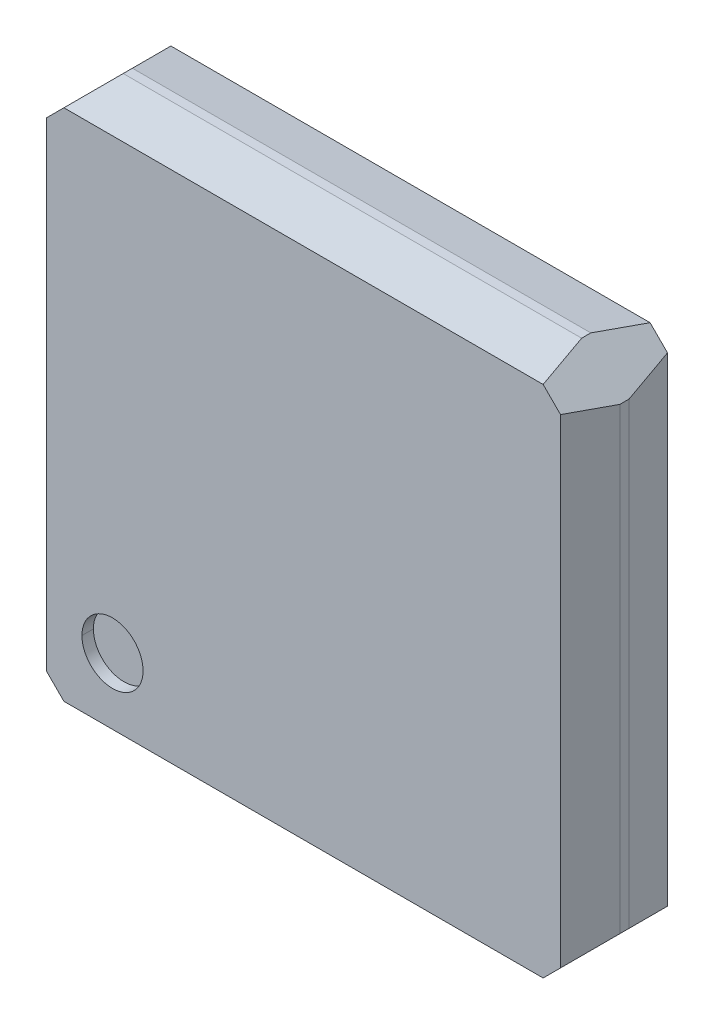
ISO-10303-21;
HEADER;
FILE_DESCRIPTION(('STEP AP214'),'2;1');
FILE_NAME('part.step','',(''),(''),'','','');
FILE_SCHEMA(('AUTOMOTIVE_DESIGN { 1 0 10303 214 1 1 1 1 }'));
ENDSEC;
DATA;
#1=APPLICATION_CONTEXT('core data for automotive mechanical design processes');
#2=APPLICATION_PROTOCOL_DEFINITION('international standard','automotive_design',2000,#1);
#3=PRODUCT_CONTEXT('',#1,'mechanical');
#4=PRODUCT('Part','Part','',(#3));
#5=PRODUCT_RELATED_PRODUCT_CATEGORY('part','',(#4));
#6=PRODUCT_DEFINITION_FORMATION('','',#4);
#7=PRODUCT_DEFINITION_CONTEXT('part definition',#1,'design');
#8=PRODUCT_DEFINITION('design','',#6,#7);
#9=PRODUCT_DEFINITION_SHAPE('','',#8);
#10=(LENGTH_UNIT() NAMED_UNIT(*) SI_UNIT(.MILLI.,.METRE.));
#11=(NAMED_UNIT(*) PLANE_ANGLE_UNIT() SI_UNIT($,.RADIAN.));
#12=(NAMED_UNIT(*) SI_UNIT($,.STERADIAN.) SOLID_ANGLE_UNIT());
#13=UNCERTAINTY_MEASURE_WITH_UNIT(LENGTH_MEASURE(1.E-05),#10,'distance_accuracy_value','');
#14=(GEOMETRIC_REPRESENTATION_CONTEXT(3) GLOBAL_UNCERTAINTY_ASSIGNED_CONTEXT((#13)) GLOBAL_UNIT_ASSIGNED_CONTEXT((#10,
#11,#12)) REPRESENTATION_CONTEXT('',''));
#15=CARTESIAN_POINT('',(0.,0.,0.));
#16=DIRECTION('',(0.,0.,1.));
#17=DIRECTION('',(1.,0.,0.));
#18=AXIS2_PLACEMENT_3D('',#15,#16,#17);
#19=CARTESIAN_POINT('',(-2.5,-2.5,1.25));
#20=DIRECTION('',(0.,0.,1.));
#21=DIRECTION('',(1.,0.,0.));
#22=AXIS2_PLACEMENT_3D('',#19,#20,#21);
#23=PLANE('',#22);
#24=CARTESIAN_POINT('',(-2.5,-2.5,1.25));
#25=DIRECTION('',(0.,0.,1.));
#26=DIRECTION('',(1.,0.,0.));
#27=AXIS2_PLACEMENT_3D('',#24,#25,#26);
#28=CIRCLE('',#27,0.4);
#29=CARTESIAN_POINT('',(-2.1,-2.5,1.25));
#30=VERTEX_POINT('',#29);
#31=CARTESIAN_POINT('',(-2.9,-2.5,1.25));
#32=VERTEX_POINT('',#31);
#33=EDGE_CURVE('E11',#30,#32,#28,.T.);
#34=ORIENTED_EDGE('',*,*,#33,.T.);
#35=CARTESIAN_POINT('',(-2.5,-2.5,1.25));
#36=DIRECTION('',(0.,0.,1.));
#37=DIRECTION('',(1.,0.,0.));
#38=AXIS2_PLACEMENT_3D('',#35,#36,#37);
#39=CIRCLE('',#38,0.4);
#40=EDGE_CURVE('E399',#32,#30,#39,.T.);
#41=ORIENTED_EDGE('',*,*,#40,.T.);
#42=EDGE_LOOP('',(#34,#41));
#43=FACE_BOUND('',#42,.T.);
#44=ADVANCED_FACE('F17',(#43),#23,.T.);
#45=CARTESIAN_POINT('',(-2.5,-2.5,1.25));
#46=DIRECTION('',(0.,0.,1.));
#47=DIRECTION('',(1.,0.,0.));
#48=AXIS2_PLACEMENT_3D('',#45,#46,#47);
#49=CYLINDRICAL_SURFACE('',#48,0.4);
#50=DIRECTION('',(0.,0.,1.));
#51=VECTOR('',#50,1.);
#52=CARTESIAN_POINT('',(-2.9,-2.5,1.25));
#53=LINE('',#52,#51);
#54=CARTESIAN_POINT('',(-2.9,-2.5,1.4));
#55=VERTEX_POINT('',#54);
#56=EDGE_CURVE('E225',#32,#55,#53,.T.);
#57=ORIENTED_EDGE('',*,*,#56,.F.);
#58=ORIENTED_EDGE('',*,*,#33,.F.);
#59=DIRECTION('',(0.,0.,1.));
#60=VECTOR('',#59,1.);
#61=CARTESIAN_POINT('',(-2.1,-2.5,1.25));
#62=LINE('',#61,#60);
#63=CARTESIAN_POINT('',(-2.1,-2.5,1.4));
#64=VERTEX_POINT('',#63);
#65=EDGE_CURVE('E231',#30,#64,#62,.T.);
#66=ORIENTED_EDGE('',*,*,#65,.T.);
#67=CARTESIAN_POINT('',(-2.5,-2.5,1.4));
#68=DIRECTION('',(0.,0.,1.));
#69=DIRECTION('',(1.,0.,0.));
#70=AXIS2_PLACEMENT_3D('',#67,#68,#69);
#71=CIRCLE('',#70,0.4);
#72=EDGE_CURVE('E26',#64,#55,#71,.T.);
#73=ORIENTED_EDGE('',*,*,#72,.T.);
#74=EDGE_LOOP('',(#57,#58,#66,#73));
#75=FACE_BOUND('',#74,.T.);
#76=ADVANCED_FACE('F19',(#75),#49,.F.);
#77=CARTESIAN_POINT('',(-21.28355697996,0.,1.4));
#78=DIRECTION('',(0.,0.,-1.));
#79=DIRECTION('',(0.,-1.,0.));
#80=AXIS2_PLACEMENT_3D('',#77,#78,#79);
#81=PLANE('',#80);
#82=ORIENTED_EDGE('',*,*,#72,.F.);
#83=CARTESIAN_POINT('',(-2.5,-2.5,1.4));
#84=DIRECTION('',(0.,0.,1.));
#85=DIRECTION('',(1.,0.,0.));
#86=AXIS2_PLACEMENT_3D('',#83,#84,#85);
#87=CIRCLE('',#86,0.4);
#88=EDGE_CURVE('E227',#55,#64,#87,.T.);
#89=ORIENTED_EDGE('',*,*,#88,.F.);
#90=EDGE_LOOP('',(#82,#89));
#91=FACE_BOUND('',#90,.T.);
#92=DIRECTION('',(0.,1.,0.));
#93=VECTOR('',#92,1.);
#94=CARTESIAN_POINT('',(3.363963800531,3.5,1.4));
#95=LINE('',#94,#93);
#96=CARTESIAN_POINT('',(3.363963800531,-3.136036199469,1.4));
#97=VERTEX_POINT('',#96);
#98=CARTESIAN_POINT('',(3.363963800531,3.136036199469,1.4));
#99=VERTEX_POINT('',#98);
#100=EDGE_CURVE('E245',#97,#99,#95,.T.);
#101=ORIENTED_EDGE('',*,*,#100,.T.);
#102=DIRECTION('',(0.707106781186548,-0.707106781186548,0.));
#103=VECTOR('',#102,1.);
#104=CARTESIAN_POINT('',(3.136036199469,3.363963800531,1.4));
#105=LINE('',#104,#103);
#106=CARTESIAN_POINT('',(3.136036199469,3.363963800531,1.4));
#107=VERTEX_POINT('',#106);
#108=EDGE_CURVE('E319',#107,#99,#105,.T.);
#109=ORIENTED_EDGE('',*,*,#108,.F.);
#110=DIRECTION('',(-1.,0.,0.));
#111=VECTOR('',#110,1.);
#112=CARTESIAN_POINT('',(-3.5,3.363963800531,1.4));
#113=LINE('',#112,#111);
#114=CARTESIAN_POINT('',(-3.136036199469,3.363963800531,1.4));
#115=VERTEX_POINT('',#114);
#116=EDGE_CURVE('E247',#107,#115,#113,.T.);
#117=ORIENTED_EDGE('',*,*,#116,.T.);
#118=DIRECTION('',(0.707106781186548,0.707106781186548,0.));
#119=VECTOR('',#118,1.);
#120=CARTESIAN_POINT('',(-3.363963800531,3.136036199469,1.4));
#121=LINE('',#120,#119);
#122=CARTESIAN_POINT('',(-3.363963800531,3.136036199469,1.4));
#123=VERTEX_POINT('',#122);
#124=EDGE_CURVE('E300',#123,#115,#121,.T.);
#125=ORIENTED_EDGE('',*,*,#124,.F.);
#126=DIRECTION('',(0.,-1.,0.));
#127=VECTOR('',#126,1.);
#128=CARTESIAN_POINT('',(-3.363963800531,3.5,1.4));
#129=LINE('',#128,#127);
#130=CARTESIAN_POINT('',(-3.363963800531,-3.136036199469,1.4));
#131=VERTEX_POINT('',#130);
#132=EDGE_CURVE('E288',#123,#131,#129,.T.);
#133=ORIENTED_EDGE('',*,*,#132,.T.);
#134=DIRECTION('',(-0.707106781186548,0.707106781186548,0.));
#135=VECTOR('',#134,1.);
#136=CARTESIAN_POINT('',(-3.136036199469,-3.363963800531,1.4));
#137=LINE('',#136,#135);
#138=CARTESIAN_POINT('',(-3.136036199469,-3.363963800531,1.4));
#139=VERTEX_POINT('',#138);
#140=EDGE_CURVE('E360',#139,#131,#137,.T.);
#141=ORIENTED_EDGE('',*,*,#140,.F.);
#142=DIRECTION('',(1.,0.,0.));
#143=VECTOR('',#142,1.);
#144=CARTESIAN_POINT('',(-3.5,-3.363963800531,1.4));
#145=LINE('',#144,#143);
#146=CARTESIAN_POINT('',(3.136036199469,-3.363963800531,1.4));
#147=VERTEX_POINT('',#146);
#148=EDGE_CURVE('E38',#139,#147,#145,.T.);
#149=ORIENTED_EDGE('',*,*,#148,.T.);
#150=DIRECTION('',(-0.707106781186548,-0.707106781186548,0.));
#151=VECTOR('',#150,1.);
#152=CARTESIAN_POINT('',(3.363963800531,-3.136036199469,1.4));
#153=LINE('',#152,#151);
#154=EDGE_CURVE('E260',#97,#147,#153,.T.);
#155=ORIENTED_EDGE('',*,*,#154,.F.);
#156=EDGE_LOOP('',(#101,#109,#117,#125,#133,#141,#149,#155));
#157=FACE_BOUND('',#156,.T.);
#158=ADVANCED_FACE('F379',(#91,#157),#81,.F.);
#159=CARTESIAN_POINT('',(-3.5,3.5,0.76));
#160=DIRECTION('',(0.978147600733765,0.,-0.20791169081795));
#161=DIRECTION('',(0.,-1.,0.));
#162=AXIS2_PLACEMENT_3D('',#159,#160,#161);
#163=PLANE('',#162);
#164=ORIENTED_EDGE('',*,*,#132,.F.);
#165=DIRECTION('',(0.203558594952977,0.203558594952977,0.957667894857889));
#166=VECTOR('',#165,1.);
#167=CARTESIAN_POINT('',(-3.5,3.,0.76));
#168=LINE('',#167,#166);
#169=CARTESIAN_POINT('',(-3.5,3.,0.76));
#170=VERTEX_POINT('',#169);
#171=EDGE_CURVE('E305',#170,#123,#168,.T.);
#172=ORIENTED_EDGE('',*,*,#171,.F.);
#173=DIRECTION('',(0.,-1.,0.));
#174=VECTOR('',#173,1.);
#175=CARTESIAN_POINT('',(-3.5,3.5,0.76));
#176=LINE('',#175,#174);
#177=CARTESIAN_POINT('',(-3.5,-3.,0.76));
#178=VERTEX_POINT('',#177);
#179=EDGE_CURVE('E368',#170,#178,#176,.T.);
#180=ORIENTED_EDGE('',*,*,#179,.T.);
#181=DIRECTION('',(-0.203558594952977,0.203558594952977,-0.957667894857889));
#182=VECTOR('',#181,1.);
#183=CARTESIAN_POINT('',(-3.363963800531,-3.136036199469,1.4));
#184=LINE('',#183,#182);
#185=EDGE_CURVE('E277',#131,#178,#184,.T.);
#186=ORIENTED_EDGE('',*,*,#185,.F.);
#187=EDGE_LOOP('',(#164,#172,#180,#186));
#188=FACE_BOUND('',#187,.T.);
#189=ADVANCED_FACE('F386',(#188),#163,.F.);
#190=CARTESIAN_POINT('',(-3.5,3.5,0.76));
#191=DIRECTION('',(0.,-0.978147600733765,-0.20791169081795));
#192=DIRECTION('',(0.,0.20791169081795,-0.978147600733765));
#193=AXIS2_PLACEMENT_3D('',#190,#191,#192);
#194=PLANE('',#193);
#195=ORIENTED_EDGE('',*,*,#116,.F.);
#196=DIRECTION('',(0.203558594952977,-0.203558594952977,0.957667894857889));
#197=VECTOR('',#196,1.);
#198=CARTESIAN_POINT('',(3.,3.5,0.76));
#199=LINE('',#198,#197);
#200=CARTESIAN_POINT('',(3.,3.5,0.76));
#201=VERTEX_POINT('',#200);
#202=EDGE_CURVE('E315',#201,#107,#199,.T.);
#203=ORIENTED_EDGE('',*,*,#202,.F.);
#204=DIRECTION('',(-1.,0.,0.));
#205=VECTOR('',#204,1.);
#206=CARTESIAN_POINT('',(-3.5,3.5,0.76));
#207=LINE('',#206,#205);
#208=CARTESIAN_POINT('',(-3.,3.5,0.76));
#209=VERTEX_POINT('',#208);
#210=EDGE_CURVE('E292',#201,#209,#207,.T.);
#211=ORIENTED_EDGE('',*,*,#210,.T.);
#212=DIRECTION('',(0.203558594952977,0.203558594952977,-0.957667894857889));
#213=VECTOR('',#212,1.);
#214=CARTESIAN_POINT('',(-3.136036199469,3.363963800531,1.4));
#215=LINE('',#214,#213);
#216=EDGE_CURVE('E330',#115,#209,#215,.T.);
#217=ORIENTED_EDGE('',*,*,#216,.F.);
#218=EDGE_LOOP('',(#195,#203,#211,#217));
#219=FACE_BOUND('',#218,.T.);
#220=ADVANCED_FACE('F421',(#219),#194,.F.);
#221=CARTESIAN_POINT('',(3.5,3.5,0.76));
#222=DIRECTION('',(-0.978147600733765,0.,-0.20791169081795));
#223=DIRECTION('',(-0.20791169081795,0.,0.978147600733765));
#224=AXIS2_PLACEMENT_3D('',#221,#222,#223);
#225=PLANE('',#224);
#226=ORIENTED_EDGE('',*,*,#100,.F.);
#227=DIRECTION('',(-0.203558594952977,-0.203558594952977,0.957667894857889));
#228=VECTOR('',#227,1.);
#229=CARTESIAN_POINT('',(3.5,-3.,0.76));
#230=LINE('',#229,#228);
#231=CARTESIAN_POINT('',(3.5,-3.,0.76));
#232=VERTEX_POINT('',#231);
#233=EDGE_CURVE('E256',#232,#97,#230,.T.);
#234=ORIENTED_EDGE('',*,*,#233,.F.);
#235=DIRECTION('',(0.,1.,0.));
#236=VECTOR('',#235,1.);
#237=CARTESIAN_POINT('',(3.5,3.5,0.76));
#238=LINE('',#237,#236);
#239=CARTESIAN_POINT('',(3.5,3.,0.76));
#240=VERTEX_POINT('',#239);
#241=EDGE_CURVE('E289',#232,#240,#238,.T.);
#242=ORIENTED_EDGE('',*,*,#241,.T.);
#243=DIRECTION('',(0.203558594952977,-0.203558594952977,-0.957667894857889));
#244=VECTOR('',#243,1.);
#245=CARTESIAN_POINT('',(3.363963800531,3.136036199469,1.4));
#246=LINE('',#245,#244);
#247=EDGE_CURVE('E297',#99,#240,#246,.T.);
#248=ORIENTED_EDGE('',*,*,#247,.F.);
#249=EDGE_LOOP('',(#226,#234,#242,#248));
#250=FACE_BOUND('',#249,.T.);
#251=ADVANCED_FACE('F475',(#250),#225,.F.);
#252=CARTESIAN_POINT('',(-3.5,-3.5,0.76));
#253=DIRECTION('',(0.,0.978147600733765,-0.20791169081795));
#254=DIRECTION('',(-1.,0.,0.));
#255=AXIS2_PLACEMENT_3D('',#252,#253,#254);
#256=PLANE('',#255);
#257=ORIENTED_EDGE('',*,*,#148,.F.);
#258=DIRECTION('',(-0.203558594952977,0.203558594952977,0.957667894857889));
#259=VECTOR('',#258,1.);
#260=CARTESIAN_POINT('',(-3.,-3.5,0.76));
#261=LINE('',#260,#259);
#262=CARTESIAN_POINT('',(-3.,-3.5,0.76));
#263=VERTEX_POINT('',#262);
#264=EDGE_CURVE('E356',#263,#139,#261,.T.);
#265=ORIENTED_EDGE('',*,*,#264,.F.);
#266=DIRECTION('',(1.,0.,0.));
#267=VECTOR('',#266,1.);
#268=CARTESIAN_POINT('',(-3.5,-3.5,0.76));
#269=LINE('',#268,#267);
#270=CARTESIAN_POINT('',(3.,-3.5,0.76));
#271=VERTEX_POINT('',#270);
#272=EDGE_CURVE('E48',#263,#271,#269,.T.);
#273=ORIENTED_EDGE('',*,*,#272,.T.);
#274=DIRECTION('',(-0.203558594952977,-0.203558594952977,-0.957667894857889));
#275=VECTOR('',#274,1.);
#276=CARTESIAN_POINT('',(3.136036199469,-3.363963800531,1.4));
#277=LINE('',#276,#275);
#278=EDGE_CURVE('E276',#147,#271,#277,.T.);
#279=ORIENTED_EDGE('',*,*,#278,.F.);
#280=EDGE_LOOP('',(#257,#265,#273,#279));
#281=FACE_BOUND('',#280,.T.);
#282=ADVANCED_FACE('F472',(#281),#256,.F.);
#283=CARTESIAN_POINT('',(-3.5,3.5,0.));
#284=DIRECTION('',(1.,0.,0.));
#285=DIRECTION('',(0.,1.,0.));
#286=AXIS2_PLACEMENT_3D('',#283,#284,#285);
#287=PLANE('',#286);
#288=ORIENTED_EDGE('',*,*,#179,.F.);
#289=DIRECTION('',(0.,0.,1.));
#290=VECTOR('',#289,1.);
#291=CARTESIAN_POINT('',(-3.5,3.,0.));
#292=LINE('',#291,#290);
#293=CARTESIAN_POINT('',(-3.5,3.,0.64));
#294=VERTEX_POINT('',#293);
#295=EDGE_CURVE('E341',#294,#170,#292,.T.);
#296=ORIENTED_EDGE('',*,*,#295,.F.);
#297=DIRECTION('',(0.,1.,0.));
#298=VECTOR('',#297,1.);
#299=CARTESIAN_POINT('',(-3.5,0.,0.64));
#300=LINE('',#299,#298);
#301=CARTESIAN_POINT('',(-3.5,-3.,0.64));
#302=VERTEX_POINT('',#301);
#303=EDGE_CURVE('E282',#302,#294,#300,.T.);
#304=ORIENTED_EDGE('',*,*,#303,.F.);
#305=DIRECTION('',(0.,0.,1.));
#306=VECTOR('',#305,1.);
#307=CARTESIAN_POINT('',(-3.5,-3.,0.));
#308=LINE('',#307,#306);
#309=EDGE_CURVE('E281',#302,#178,#308,.T.);
#310=ORIENTED_EDGE('',*,*,#309,.T.);
#311=EDGE_LOOP('',(#288,#296,#304,#310));
#312=FACE_BOUND('',#311,.T.);
#313=ADVANCED_FACE('F391',(#312),#287,.F.);
#314=CARTESIAN_POINT('',(-3.5,3.5,0.));
#315=DIRECTION('',(0.,-1.,0.));
#316=DIRECTION('',(0.,0.,-1.));
#317=AXIS2_PLACEMENT_3D('',#314,#315,#316);
#318=PLANE('',#317);
#319=ORIENTED_EDGE('',*,*,#210,.F.);
#320=DIRECTION('',(0.,0.,1.));
#321=VECTOR('',#320,1.);
#322=CARTESIAN_POINT('',(3.,3.5,0.));
#323=LINE('',#322,#321);
#324=CARTESIAN_POINT('',(3.,3.5,0.64));
#325=VERTEX_POINT('',#324);
#326=EDGE_CURVE('E311',#325,#201,#323,.T.);
#327=ORIENTED_EDGE('',*,*,#326,.F.);
#328=DIRECTION('',(1.,0.,0.));
#329=VECTOR('',#328,1.);
#330=CARTESIAN_POINT('',(-21.28355697996,3.5,0.64));
#331=LINE('',#330,#329);
#332=CARTESIAN_POINT('',(-3.,3.5,0.64));
#333=VERTEX_POINT('',#332);
#334=EDGE_CURVE('E327',#333,#325,#331,.T.);
#335=ORIENTED_EDGE('',*,*,#334,.F.);
#336=DIRECTION('',(0.,0.,1.));
#337=VECTOR('',#336,1.);
#338=CARTESIAN_POINT('',(-3.,3.5,0.));
#339=LINE('',#338,#337);
#340=EDGE_CURVE('E334',#333,#209,#339,.T.);
#341=ORIENTED_EDGE('',*,*,#340,.T.);
#342=EDGE_LOOP('',(#319,#327,#335,#341));
#343=FACE_BOUND('',#342,.T.);
#344=ADVANCED_FACE('F465',(#343),#318,.F.);
#345=CARTESIAN_POINT('',(3.5,3.5,0.));
#346=DIRECTION('',(-1.,0.,0.));
#347=DIRECTION('',(0.,0.,1.));
#348=AXIS2_PLACEMENT_3D('',#345,#346,#347);
#349=PLANE('',#348);
#350=ORIENTED_EDGE('',*,*,#241,.F.);
#351=DIRECTION('',(0.,0.,1.));
#352=VECTOR('',#351,1.);
#353=CARTESIAN_POINT('',(3.5,-3.,0.));
#354=LINE('',#353,#352);
#355=CARTESIAN_POINT('',(3.5,-3.,0.64));
#356=VERTEX_POINT('',#355);
#357=EDGE_CURVE('E198',#356,#232,#354,.T.);
#358=ORIENTED_EDGE('',*,*,#357,.F.);
#359=DIRECTION('',(0.,-1.,0.));
#360=VECTOR('',#359,1.);
#361=CARTESIAN_POINT('',(3.5,0.,0.64));
#362=LINE('',#361,#360);
#363=CARTESIAN_POINT('',(3.5,3.,0.64));
#364=VERTEX_POINT('',#363);
#365=EDGE_CURVE('E197',#364,#356,#362,.T.);
#366=ORIENTED_EDGE('',*,*,#365,.F.);
#367=DIRECTION('',(0.,0.,1.));
#368=VECTOR('',#367,1.);
#369=CARTESIAN_POINT('',(3.5,3.,0.));
#370=LINE('',#369,#368);
#371=EDGE_CURVE('E193',#364,#240,#370,.T.);
#372=ORIENTED_EDGE('',*,*,#371,.T.);
#373=EDGE_LOOP('',(#350,#358,#366,#372));
#374=FACE_BOUND('',#373,.T.);
#375=ADVANCED_FACE('F457',(#374),#349,.F.);
#376=CARTESIAN_POINT('',(-3.5,-3.5,0.));
#377=DIRECTION('',(0.,1.,0.));
#378=DIRECTION('',(1.,0.,0.));
#379=AXIS2_PLACEMENT_3D('',#376,#377,#378);
#380=PLANE('',#379);
#381=ORIENTED_EDGE('',*,*,#272,.F.);
#382=DIRECTION('',(0.,0.,-1.));
#383=VECTOR('',#382,1.);
#384=CARTESIAN_POINT('',(-3.,-3.5,0.));
#385=LINE('',#384,#383);
#386=CARTESIAN_POINT('',(-3.,-3.5,0.64));
#387=VERTEX_POINT('',#386);
#388=EDGE_CURVE('E353',#263,#387,#385,.T.);
#389=ORIENTED_EDGE('',*,*,#388,.T.);
#390=DIRECTION('',(-1.,0.,0.));
#391=VECTOR('',#390,1.);
#392=CARTESIAN_POINT('',(-21.28355697996,-3.5,0.64));
#393=LINE('',#392,#391);
#394=CARTESIAN_POINT('',(3.,-3.5,0.64));
#395=VERTEX_POINT('',#394);
#396=EDGE_CURVE('E261',#395,#387,#393,.T.);
#397=ORIENTED_EDGE('',*,*,#396,.F.);
#398=DIRECTION('',(0.,0.,1.));
#399=VECTOR('',#398,1.);
#400=CARTESIAN_POINT('',(3.,-3.5,0.));
#401=LINE('',#400,#399);
#402=EDGE_CURVE('E250',#395,#271,#401,.T.);
#403=ORIENTED_EDGE('',*,*,#402,.T.);
#404=EDGE_LOOP('',(#381,#389,#397,#403));
#405=FACE_BOUND('',#404,.T.);
#406=ADVANCED_FACE('F434',(#405),#380,.F.);
#407=CARTESIAN_POINT('',(-3.5,-3.,0.));
#408=DIRECTION('',(0.707106781186548,0.707106781186548,0.));
#409=DIRECTION('',(0.,0.,-1.));
#410=AXIS2_PLACEMENT_3D('',#407,#408,#409);
#411=PLANE('',#410);
#412=ORIENTED_EDGE('',*,*,#185,.T.);
#413=ORIENTED_EDGE('',*,*,#309,.F.);
#414=DIRECTION('',(-0.203558594952977,0.203558594952977,0.957667894857889));
#415=VECTOR('',#414,1.);
#416=CARTESIAN_POINT('',(-3.363963800531,-3.136036199469,0.));
#417=LINE('',#416,#415);
#418=CARTESIAN_POINT('',(-3.363963800531,-3.136036199469,0.));
#419=VERTEX_POINT('',#418);
#420=EDGE_CURVE('E304',#419,#302,#417,.T.);
#421=ORIENTED_EDGE('',*,*,#420,.F.);
#422=DIRECTION('',(-0.707106781186548,0.707106781186548,0.));
#423=VECTOR('',#422,1.);
#424=CARTESIAN_POINT('',(-3.136036199469,-3.363963800531,0.));
#425=LINE('',#424,#423);
#426=CARTESIAN_POINT('',(-3.136036199469,-3.363963800531,0.));
#427=VERTEX_POINT('',#426);
#428=EDGE_CURVE('E251',#427,#419,#425,.T.);
#429=ORIENTED_EDGE('',*,*,#428,.F.);
#430=DIRECTION('',(-0.203558594952977,0.203558594952977,-0.957667894857889));
#431=VECTOR('',#430,1.);
#432=CARTESIAN_POINT('',(-3.,-3.5,0.64));
#433=LINE('',#432,#431);
#434=EDGE_CURVE('E209',#387,#427,#433,.T.);
#435=ORIENTED_EDGE('',*,*,#434,.F.);
#436=ORIENTED_EDGE('',*,*,#388,.F.);
#437=ORIENTED_EDGE('',*,*,#264,.T.);
#438=ORIENTED_EDGE('',*,*,#140,.T.);
#439=EDGE_LOOP('',(#412,#413,#421,#429,#435,#436,#437,#438));
#440=FACE_BOUND('',#439,.T.);
#441=ADVANCED_FACE('F384',(#440),#411,.F.);
#442=CARTESIAN_POINT('',(-3.363963800531,0.,0.));
#443=DIRECTION('',(-0.978147600733765,0.,-0.20791169081795));
#444=DIRECTION('',(-0.20791169081795,0.,0.978147600733765));
#445=AXIS2_PLACEMENT_3D('',#442,#443,#444);
#446=PLANE('',#445);
#447=DIRECTION('',(0.203558594952977,0.203558594952977,-0.957667894857889));
#448=VECTOR('',#447,1.);
#449=CARTESIAN_POINT('',(-3.5,3.,0.64));
#450=LINE('',#449,#448);
#451=CARTESIAN_POINT('',(-3.363963800531,3.136036199469,0.));
#452=VERTEX_POINT('',#451);
#453=EDGE_CURVE('E338',#294,#452,#450,.T.);
#454=ORIENTED_EDGE('',*,*,#453,.T.);
#455=DIRECTION('',(0.,1.,0.));
#456=VECTOR('',#455,1.);
#457=CARTESIAN_POINT('',(-3.363963800531,0.,0.));
#458=LINE('',#457,#456);
#459=EDGE_CURVE('E255',#419,#452,#458,.T.);
#460=ORIENTED_EDGE('',*,*,#459,.F.);
#461=ORIENTED_EDGE('',*,*,#420,.T.);
#462=ORIENTED_EDGE('',*,*,#303,.T.);
#463=EDGE_LOOP('',(#454,#460,#461,#462));
#464=FACE_BOUND('',#463,.T.);
#465=ADVANCED_FACE('F433',(#464),#446,.T.);
#466=CARTESIAN_POINT('',(-3.,3.5,0.));
#467=DIRECTION('',(0.707106781186548,-0.707106781186548,0.));
#468=DIRECTION('',(0.,0.,-1.));
#469=AXIS2_PLACEMENT_3D('',#466,#467,#468);
#470=PLANE('',#469);
#471=ORIENTED_EDGE('',*,*,#216,.T.);
#472=ORIENTED_EDGE('',*,*,#340,.F.);
#473=DIRECTION('',(0.203558594952977,0.203558594952977,0.957667894857889));
#474=VECTOR('',#473,1.);
#475=CARTESIAN_POINT('',(-3.136036199469,3.363963800531,0.));
#476=LINE('',#475,#474);
#477=CARTESIAN_POINT('',(-3.136036199469,3.363963800531,0.));
#478=VERTEX_POINT('',#477);
#479=EDGE_CURVE('E323',#478,#333,#476,.T.);
#480=ORIENTED_EDGE('',*,*,#479,.F.);
#481=DIRECTION('',(0.707106781186548,0.707106781186548,0.));
#482=VECTOR('',#481,1.);
#483=CARTESIAN_POINT('',(-3.363963800531,3.136036199469,0.));
#484=LINE('',#483,#482);
#485=EDGE_CURVE('E221',#452,#478,#484,.T.);
#486=ORIENTED_EDGE('',*,*,#485,.F.);
#487=ORIENTED_EDGE('',*,*,#453,.F.);
#488=ORIENTED_EDGE('',*,*,#295,.T.);
#489=ORIENTED_EDGE('',*,*,#171,.T.);
#490=ORIENTED_EDGE('',*,*,#124,.T.);
#491=EDGE_LOOP('',(#471,#472,#480,#486,#487,#488,#489,#490));
#492=FACE_BOUND('',#491,.T.);
#493=ADVANCED_FACE('F438',(#492),#470,.F.);
#494=CARTESIAN_POINT('',(-21.28355697996,3.363963800531,0.));
#495=DIRECTION('',(0.,0.978147600733765,-0.20791169081795));
#496=DIRECTION('',(-1.,0.,0.));
#497=AXIS2_PLACEMENT_3D('',#494,#495,#496);
#498=PLANE('',#497);
#499=DIRECTION('',(0.203558594952977,-0.203558594952977,-0.957667894857889));
#500=VECTOR('',#499,1.);
#501=CARTESIAN_POINT('',(3.,3.5,0.64));
#502=LINE('',#501,#500);
#503=CARTESIAN_POINT('',(3.136036199469,3.363963800531,0.));
#504=VERTEX_POINT('',#503);
#505=EDGE_CURVE('E308',#325,#504,#502,.T.);
#506=ORIENTED_EDGE('',*,*,#505,.T.);
#507=DIRECTION('',(1.,0.,0.));
#508=VECTOR('',#507,1.);
#509=CARTESIAN_POINT('',(-21.28355697996,3.363963800531,0.));
#510=LINE('',#509,#508);
#511=EDGE_CURVE('E214',#478,#504,#510,.T.);
#512=ORIENTED_EDGE('',*,*,#511,.F.);
#513=ORIENTED_EDGE('',*,*,#479,.T.);
#514=ORIENTED_EDGE('',*,*,#334,.T.);
#515=EDGE_LOOP('',(#506,#512,#513,#514));
#516=FACE_BOUND('',#515,.T.);
#517=ADVANCED_FACE('F435',(#516),#498,.T.);
#518=CARTESIAN_POINT('',(3.5,3.,0.));
#519=DIRECTION('',(-0.707106781186548,-0.707106781186548,0.));
#520=DIRECTION('',(-0.707106781186548,0.707106781186548,0.));
#521=AXIS2_PLACEMENT_3D('',#518,#519,#520);
#522=PLANE('',#521);
#523=ORIENTED_EDGE('',*,*,#247,.T.);
#524=ORIENTED_EDGE('',*,*,#371,.F.);
#525=DIRECTION('',(0.203558594952977,-0.203558594952977,0.957667894857889));
#526=VECTOR('',#525,1.);
#527=CARTESIAN_POINT('',(3.363963800531,3.136036199469,0.));
#528=LINE('',#527,#526);
#529=CARTESIAN_POINT('',(3.363963800531,3.136036199469,0.));
#530=VERTEX_POINT('',#529);
#531=EDGE_CURVE('E184',#530,#364,#528,.T.);
#532=ORIENTED_EDGE('',*,*,#531,.F.);
#533=DIRECTION('',(0.707106781186548,-0.707106781186548,0.));
#534=VECTOR('',#533,1.);
#535=CARTESIAN_POINT('',(3.136036199469,3.363963800531,0.));
#536=LINE('',#535,#534);
#537=EDGE_CURVE('E190',#504,#530,#536,.T.);
#538=ORIENTED_EDGE('',*,*,#537,.F.);
#539=ORIENTED_EDGE('',*,*,#505,.F.);
#540=ORIENTED_EDGE('',*,*,#326,.T.);
#541=ORIENTED_EDGE('',*,*,#202,.T.);
#542=ORIENTED_EDGE('',*,*,#108,.T.);
#543=EDGE_LOOP('',(#523,#524,#532,#538,#539,#540,#541,#542));
#544=FACE_BOUND('',#543,.T.);
#545=ADVANCED_FACE('F187',(#544),#522,.F.);
#546=CARTESIAN_POINT('',(3.363963800531,0.,0.));
#547=DIRECTION('',(0.978147600733765,0.,-0.20791169081795));
#548=DIRECTION('',(0.,-1.,0.));
#549=AXIS2_PLACEMENT_3D('',#546,#547,#548);
#550=PLANE('',#549);
#551=DIRECTION('',(-0.203558594952977,-0.203558594952977,-0.957667894857889));
#552=VECTOR('',#551,1.);
#553=CARTESIAN_POINT('',(3.5,-3.,0.64));
#554=LINE('',#553,#552);
#555=CARTESIAN_POINT('',(3.363963800531,-3.136036199469,0.));
#556=VERTEX_POINT('',#555);
#557=EDGE_CURVE('E204',#356,#556,#554,.T.);
#558=ORIENTED_EDGE('',*,*,#557,.T.);
#559=DIRECTION('',(0.,-1.,0.));
#560=VECTOR('',#559,1.);
#561=CARTESIAN_POINT('',(3.363963800531,0.,0.));
#562=LINE('',#561,#560);
#563=EDGE_CURVE('E201',#530,#556,#562,.T.);
#564=ORIENTED_EDGE('',*,*,#563,.F.);
#565=ORIENTED_EDGE('',*,*,#531,.T.);
#566=ORIENTED_EDGE('',*,*,#365,.T.);
#567=EDGE_LOOP('',(#558,#564,#565,#566));
#568=FACE_BOUND('',#567,.T.);
#569=ADVANCED_FACE('F202',(#568),#550,.T.);
#570=CARTESIAN_POINT('',(3.,-3.5,0.));
#571=DIRECTION('',(-0.707106781186548,0.707106781186548,0.));
#572=DIRECTION('',(0.,0.,1.));
#573=AXIS2_PLACEMENT_3D('',#570,#571,#572);
#574=PLANE('',#573);
#575=ORIENTED_EDGE('',*,*,#233,.T.);
#576=ORIENTED_EDGE('',*,*,#154,.T.);
#577=ORIENTED_EDGE('',*,*,#278,.T.);
#578=ORIENTED_EDGE('',*,*,#402,.F.);
#579=DIRECTION('',(-0.203558594952977,-0.203558594952977,0.957667894857889));
#580=VECTOR('',#579,1.);
#581=CARTESIAN_POINT('',(3.136036199469,-3.363963800531,0.));
#582=LINE('',#581,#580);
#583=CARTESIAN_POINT('',(3.136036199469,-3.363963800531,0.));
#584=VERTEX_POINT('',#583);
#585=EDGE_CURVE('E234',#584,#395,#582,.T.);
#586=ORIENTED_EDGE('',*,*,#585,.F.);
#587=DIRECTION('',(-0.707106781186548,-0.707106781186548,0.));
#588=VECTOR('',#587,1.);
#589=CARTESIAN_POINT('',(3.363963800531,-3.136036199469,0.));
#590=LINE('',#589,#588);
#591=EDGE_CURVE('E241',#556,#584,#590,.T.);
#592=ORIENTED_EDGE('',*,*,#591,.F.);
#593=ORIENTED_EDGE('',*,*,#557,.F.);
#594=ORIENTED_EDGE('',*,*,#357,.T.);
#595=EDGE_LOOP('',(#575,#576,#577,#578,#586,#592,#593,#594));
#596=FACE_BOUND('',#595,.T.);
#597=ADVANCED_FACE('F445',(#596),#574,.F.);
#598=CARTESIAN_POINT('',(-21.28355697996,-3.363963800531,0.));
#599=DIRECTION('',(0.,-0.978147600733765,-0.20791169081795));
#600=DIRECTION('',(0.,0.20791169081795,-0.978147600733765));
#601=AXIS2_PLACEMENT_3D('',#598,#599,#600);
#602=PLANE('',#601);
#603=ORIENTED_EDGE('',*,*,#434,.T.);
#604=DIRECTION('',(-1.,0.,0.));
#605=VECTOR('',#604,1.);
#606=CARTESIAN_POINT('',(-21.28355697996,-3.363963800531,0.));
#607=LINE('',#606,#605);
#608=EDGE_CURVE('E243',#584,#427,#607,.T.);
#609=ORIENTED_EDGE('',*,*,#608,.F.);
#610=ORIENTED_EDGE('',*,*,#585,.T.);
#611=ORIENTED_EDGE('',*,*,#396,.T.);
#612=EDGE_LOOP('',(#603,#609,#610,#611));
#613=FACE_BOUND('',#612,.T.);
#614=ADVANCED_FACE('F442',(#613),#602,.T.);
#615=CARTESIAN_POINT('',(-21.28355697996,0.,0.));
#616=DIRECTION('',(0.,0.,-1.));
#617=DIRECTION('',(0.,-1.,0.));
#618=AXIS2_PLACEMENT_3D('',#615,#616,#617);
#619=PLANE('',#618);
#620=ORIENTED_EDGE('',*,*,#591,.T.);
#621=ORIENTED_EDGE('',*,*,#608,.T.);
#622=ORIENTED_EDGE('',*,*,#428,.T.);
#623=ORIENTED_EDGE('',*,*,#459,.T.);
#624=ORIENTED_EDGE('',*,*,#485,.T.);
#625=ORIENTED_EDGE('',*,*,#511,.T.);
#626=ORIENTED_EDGE('',*,*,#537,.T.);
#627=ORIENTED_EDGE('',*,*,#563,.T.);
#628=EDGE_LOOP('',(#620,#621,#622,#623,#624,#625,#626,#627));
#629=FACE_BOUND('',#628,.T.);
#630=ADVANCED_FACE('F211',(#629),#619,.T.);
#631=CARTESIAN_POINT('',(-2.5,-2.5,1.25));
#632=DIRECTION('',(0.,0.,1.));
#633=DIRECTION('',(1.,0.,0.));
#634=AXIS2_PLACEMENT_3D('',#631,#632,#633);
#635=CYLINDRICAL_SURFACE('',#634,0.4);
#636=ORIENTED_EDGE('',*,*,#40,.F.);
#637=ORIENTED_EDGE('',*,*,#56,.T.);
#638=ORIENTED_EDGE('',*,*,#88,.T.);
#639=ORIENTED_EDGE('',*,*,#65,.F.);
#640=EDGE_LOOP('',(#636,#637,#638,#639));
#641=FACE_BOUND('',#640,.T.);
#642=ADVANCED_FACE('F409',(#641),#635,.F.);
#643=CLOSED_SHELL('',(#44,#76,#158,#189,#220,#251,#282,#313,#344,#375,#406,#441,#465,#493,#517,
#545,#569,#597,#614,#630,#642));
#644=MANIFOLD_SOLID_BREP('B1',#643);
#645=ADVANCED_BREP_SHAPE_REPRESENTATION('',(#18,#644),#14);
#646=SHAPE_DEFINITION_REPRESENTATION(#9,#645);
ENDSEC;
END-ISO-10303-21;
